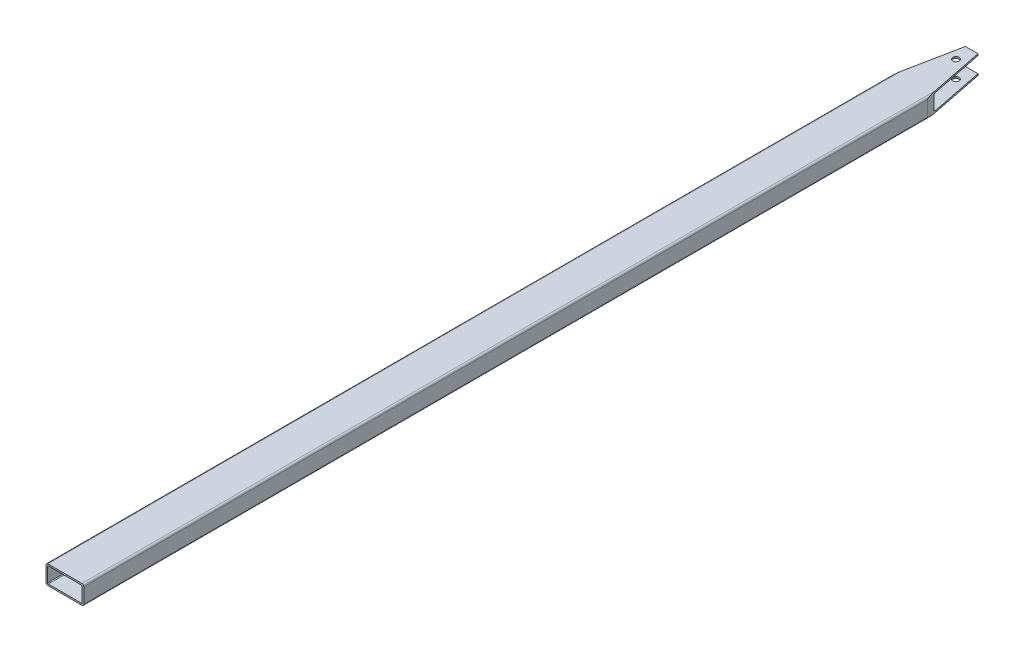
ISO-10303-21;
HEADER;
FILE_DESCRIPTION(('STEP AP214'),'2;1');
FILE_NAME('part.step','',(''),(''),'','','');
FILE_SCHEMA(('AUTOMOTIVE_DESIGN { 1 0 10303 214 1 1 1 1 }'));
ENDSEC;
DATA;
#1=APPLICATION_CONTEXT('core data for automotive mechanical design processes');
#2=APPLICATION_PROTOCOL_DEFINITION('international standard','automotive_design',2000,#1);
#3=PRODUCT_CONTEXT('',#1,'mechanical');
#4=PRODUCT('Part','Part','',(#3));
#5=PRODUCT_RELATED_PRODUCT_CATEGORY('part','',(#4));
#6=PRODUCT_DEFINITION_FORMATION('','',#4);
#7=PRODUCT_DEFINITION_CONTEXT('part definition',#1,'design');
#8=PRODUCT_DEFINITION('design','',#6,#7);
#9=PRODUCT_DEFINITION_SHAPE('','',#8);
#10=(LENGTH_UNIT() NAMED_UNIT(*) SI_UNIT(.MILLI.,.METRE.));
#11=(NAMED_UNIT(*) PLANE_ANGLE_UNIT() SI_UNIT($,.RADIAN.));
#12=(NAMED_UNIT(*) SI_UNIT($,.STERADIAN.) SOLID_ANGLE_UNIT());
#13=UNCERTAINTY_MEASURE_WITH_UNIT(LENGTH_MEASURE(1.E-05),#10,'distance_accuracy_value','');
#14=(GEOMETRIC_REPRESENTATION_CONTEXT(3) GLOBAL_UNCERTAINTY_ASSIGNED_CONTEXT((#13)) GLOBAL_UNIT_ASSIGNED_CONTEXT((#10,
#11,#12)) REPRESENTATION_CONTEXT('',''));
#15=CARTESIAN_POINT('',(0.,0.,0.));
#16=DIRECTION('',(0.,0.,1.));
#17=DIRECTION('',(1.,0.,0.));
#18=AXIS2_PLACEMENT_3D('',#15,#16,#17);
#19=CARTESIAN_POINT('',(34.29,-15.24,-914.4));
#20=DIRECTION('',(0.,0.,1.));
#21=DIRECTION('',(1.,0.,0.));
#22=AXIS2_PLACEMENT_3D('',#19,#20,#21);
#23=PLANE('',#22);
#24=DIRECTION('',(1.,0.,0.));
#25=VECTOR('',#24,1.);
#26=CARTESIAN_POINT('',(34.29,-19.05,-914.4));
#27=LINE('',#26,#25);
#28=CARTESIAN_POINT('',(-12.7000000000008,-19.05,-914.4));
#29=VERTEX_POINT('',#28);
#30=CARTESIAN_POINT('',(12.6999999999992,-19.05,-914.4));
#31=VERTEX_POINT('',#30);
#32=EDGE_CURVE('E190',#29,#31,#27,.T.);
#33=ORIENTED_EDGE('',*,*,#32,.F.);
#34=DIRECTION('',(0.,1.,0.));
#35=VECTOR('',#34,1.);
#36=CARTESIAN_POINT('',(-12.7000000000008,-19.05,-914.4));
#37=LINE('',#36,#35);
#38=CARTESIAN_POINT('',(-12.7000000000008,-15.875,-914.4));
#39=VERTEX_POINT('',#38);
#40=EDGE_CURVE('E172',#29,#39,#37,.T.);
#41=ORIENTED_EDGE('',*,*,#40,.T.);
#42=DIRECTION('',(1.,0.,0.));
#43=VECTOR('',#42,1.);
#44=CARTESIAN_POINT('',(33.3375,-15.875,-914.4));
#45=LINE('',#44,#43);
#46=CARTESIAN_POINT('',(12.6999999999992,-15.875,-914.4));
#47=VERTEX_POINT('',#46);
#48=EDGE_CURVE('E202',#39,#47,#45,.T.);
#49=ORIENTED_EDGE('',*,*,#48,.T.);
#50=DIRECTION('',(0.,1.,0.));
#51=VECTOR('',#50,1.);
#52=CARTESIAN_POINT('',(12.6999999999992,-19.05,-914.4));
#53=LINE('',#52,#51);
#54=EDGE_CURVE('E195',#31,#47,#53,.T.);
#55=ORIENTED_EDGE('',*,*,#54,.F.);
#56=EDGE_LOOP('',(#33,#41,#49,#55));
#57=FACE_BOUND('',#56,.T.);
#58=ADVANCED_FACE('F37',(#57),#23,.F.);
#59=CARTESIAN_POINT('',(34.29,-15.24,914.4));
#60=DIRECTION('',(0.,0.,1.));
#61=DIRECTION('',(1.,0.,0.));
#62=AXIS2_PLACEMENT_3D('',#59,#60,#61);
#63=PLANE('',#62);
#64=CARTESIAN_POINT('',(34.29,-15.24,914.4));
#65=DIRECTION('',(0.,0.,1.));
#66=DIRECTION('',(1.,0.,0.));
#67=AXIS2_PLACEMENT_3D('',#64,#65,#66);
#68=CIRCLE('',#67,3.81);
#69=CARTESIAN_POINT('',(34.29,-19.05,914.4));
#70=VERTEX_POINT('',#69);
#71=CARTESIAN_POINT('',(38.1,-15.24,914.4));
#72=VERTEX_POINT('',#71);
#73=EDGE_CURVE('E244',#70,#72,#68,.T.);
#74=ORIENTED_EDGE('',*,*,#73,.T.);
#75=DIRECTION('',(0.,1.,0.));
#76=VECTOR('',#75,1.);
#77=CARTESIAN_POINT('',(38.1,-15.24,914.4));
#78=LINE('',#77,#76);
#79=CARTESIAN_POINT('',(38.1,15.24,914.4));
#80=VERTEX_POINT('',#79);
#81=EDGE_CURVE('E247',#72,#80,#78,.T.);
#82=ORIENTED_EDGE('',*,*,#81,.T.);
#83=CARTESIAN_POINT('',(34.29,15.24,914.4));
#84=DIRECTION('',(0.,0.,1.));
#85=DIRECTION('',(1.,0.,0.));
#86=AXIS2_PLACEMENT_3D('',#83,#84,#85);
#87=CIRCLE('',#86,3.81);
#88=CARTESIAN_POINT('',(34.29,19.05,914.4));
#89=VERTEX_POINT('',#88);
#90=EDGE_CURVE('E249',#80,#89,#87,.T.);
#91=ORIENTED_EDGE('',*,*,#90,.T.);
#92=DIRECTION('',(-1.,0.,0.));
#93=VECTOR('',#92,1.);
#94=CARTESIAN_POINT('',(34.29,19.05,914.4));
#95=LINE('',#94,#93);
#96=CARTESIAN_POINT('',(-34.29,19.05,914.4));
#97=VERTEX_POINT('',#96);
#98=EDGE_CURVE('E251',#89,#97,#95,.T.);
#99=ORIENTED_EDGE('',*,*,#98,.T.);
#100=CARTESIAN_POINT('',(-34.29,15.24,914.4));
#101=DIRECTION('',(0.,0.,1.));
#102=DIRECTION('',(1.,0.,0.));
#103=AXIS2_PLACEMENT_3D('',#100,#101,#102);
#104=CIRCLE('',#103,3.81);
#105=CARTESIAN_POINT('',(-38.1,15.24,914.4));
#106=VERTEX_POINT('',#105);
#107=EDGE_CURVE('E253',#97,#106,#104,.T.);
#108=ORIENTED_EDGE('',*,*,#107,.T.);
#109=DIRECTION('',(0.,-1.,0.));
#110=VECTOR('',#109,1.);
#111=CARTESIAN_POINT('',(-38.1,-15.24,914.4));
#112=LINE('',#111,#110);
#113=CARTESIAN_POINT('',(-38.1,-15.24,914.4));
#114=VERTEX_POINT('',#113);
#115=EDGE_CURVE('E255',#106,#114,#112,.T.);
#116=ORIENTED_EDGE('',*,*,#115,.T.);
#117=CARTESIAN_POINT('',(-34.29,-15.24,914.4));
#118=DIRECTION('',(0.,0.,1.));
#119=DIRECTION('',(1.,0.,0.));
#120=AXIS2_PLACEMENT_3D('',#117,#118,#119);
#121=CIRCLE('',#120,3.81);
#122=CARTESIAN_POINT('',(-34.29,-19.05,914.4));
#123=VERTEX_POINT('',#122);
#124=EDGE_CURVE('E257',#114,#123,#121,.T.);
#125=ORIENTED_EDGE('',*,*,#124,.T.);
#126=DIRECTION('',(1.,0.,0.));
#127=VECTOR('',#126,1.);
#128=CARTESIAN_POINT('',(34.29,-19.05,914.4));
#129=LINE('',#128,#127);
#130=EDGE_CURVE('E259',#123,#70,#129,.T.);
#131=ORIENTED_EDGE('',*,*,#130,.T.);
#132=EDGE_LOOP('',(#74,#82,#91,#99,#108,#116,#125,#131));
#133=FACE_BOUND('',#132,.T.);
#134=DIRECTION('',(-1.,0.,0.));
#135=VECTOR('',#134,1.);
#136=CARTESIAN_POINT('',(33.3375,15.875,914.4));
#137=LINE('',#136,#135);
#138=CARTESIAN_POINT('',(33.3375,15.875,914.4));
#139=VERTEX_POINT('',#138);
#140=CARTESIAN_POINT('',(-33.3375,15.875,914.4));
#141=VERTEX_POINT('',#140);
#142=EDGE_CURVE('E199',#139,#141,#137,.T.);
#143=ORIENTED_EDGE('',*,*,#142,.F.);
#144=CARTESIAN_POINT('',(33.3375,14.2875,914.4));
#145=DIRECTION('',(0.,0.,1.));
#146=DIRECTION('',(1.,0.,0.));
#147=AXIS2_PLACEMENT_3D('',#144,#145,#146);
#148=CIRCLE('',#147,1.58749999999998);
#149=CARTESIAN_POINT('',(34.925,14.2875,914.4));
#150=VERTEX_POINT('',#149);
#151=EDGE_CURVE('E196',#150,#139,#148,.T.);
#152=ORIENTED_EDGE('',*,*,#151,.F.);
#153=DIRECTION('',(0.,1.,0.));
#154=VECTOR('',#153,1.);
#155=CARTESIAN_POINT('',(34.925,14.2875,914.4));
#156=LINE('',#155,#154);
#157=CARTESIAN_POINT('',(34.925,-14.2875,914.4));
#158=VERTEX_POINT('',#157);
#159=EDGE_CURVE('E218',#158,#150,#156,.T.);
#160=ORIENTED_EDGE('',*,*,#159,.F.);
#161=CARTESIAN_POINT('',(33.3375,-14.2875,914.4));
#162=DIRECTION('',(0.,0.,1.));
#163=DIRECTION('',(1.,0.,0.));
#164=AXIS2_PLACEMENT_3D('',#161,#162,#163);
#165=CIRCLE('',#164,1.58749999999999);
#166=CARTESIAN_POINT('',(33.3375,-15.875,914.4));
#167=VERTEX_POINT('',#166);
#168=EDGE_CURVE('E215',#167,#158,#165,.T.);
#169=ORIENTED_EDGE('',*,*,#168,.F.);
#170=DIRECTION('',(1.,0.,0.));
#171=VECTOR('',#170,1.);
#172=CARTESIAN_POINT('',(33.3375,-15.875,914.4));
#173=LINE('',#172,#171);
#174=CARTESIAN_POINT('',(-33.3375,-15.875,914.4));
#175=VERTEX_POINT('',#174);
#176=EDGE_CURVE('E213',#175,#167,#173,.T.);
#177=ORIENTED_EDGE('',*,*,#176,.F.);
#178=CARTESIAN_POINT('',(-33.3375,-14.2875,914.4));
#179=DIRECTION('',(0.,0.,1.));
#180=DIRECTION('',(1.,0.,0.));
#181=AXIS2_PLACEMENT_3D('',#178,#179,#180);
#182=CIRCLE('',#181,1.58749999999999);
#183=CARTESIAN_POINT('',(-34.925,-14.2875,914.4));
#184=VERTEX_POINT('',#183);
#185=EDGE_CURVE('E211',#184,#175,#182,.T.);
#186=ORIENTED_EDGE('',*,*,#185,.F.);
#187=DIRECTION('',(0.,-1.,0.));
#188=VECTOR('',#187,1.);
#189=CARTESIAN_POINT('',(-34.925,14.2875,914.4));
#190=LINE('',#189,#188);
#191=CARTESIAN_POINT('',(-34.925,14.2875,914.4));
#192=VERTEX_POINT('',#191);
#193=EDGE_CURVE('E209',#192,#184,#190,.T.);
#194=ORIENTED_EDGE('',*,*,#193,.F.);
#195=CARTESIAN_POINT('',(-33.3375,14.2875,914.4));
#196=DIRECTION('',(0.,0.,1.));
#197=DIRECTION('',(1.,0.,0.));
#198=AXIS2_PLACEMENT_3D('',#195,#196,#197);
#199=CIRCLE('',#198,1.58749999999999);
#200=EDGE_CURVE('E207',#141,#192,#199,.T.);
#201=ORIENTED_EDGE('',*,*,#200,.F.);
#202=EDGE_LOOP('',(#143,#152,#160,#169,#177,#186,#194,#201));
#203=FACE_BOUND('',#202,.T.);
#204=ADVANCED_FACE('F357',(#133,#203),#63,.T.);
#205=CARTESIAN_POINT('',(34.29,-15.24,914.4));
#206=DIRECTION('',(0.,0.,-1.));
#207=DIRECTION('',(-1.,0.,0.));
#208=AXIS2_PLACEMENT_3D('',#205,#206,#207);
#209=CYLINDRICAL_SURFACE('',#208,3.81);
#210=DIRECTION('',(0.,0.,-1.));
#211=VECTOR('',#210,1.);
#212=CARTESIAN_POINT('',(34.29,-19.05,914.4));
#213=LINE('',#212,#211);
#214=CARTESIAN_POINT('',(34.29,-19.05,-806.449999999999));
#215=VERTEX_POINT('',#214);
#216=EDGE_CURVE('E261',#70,#215,#213,.T.);
#217=ORIENTED_EDGE('',*,*,#216,.T.);
#218=CARTESIAN_POINT('',(34.29,-15.24,-806.45));
#219=DIRECTION('',(-0.980580675690919,0.,0.19611613513819));
#220=DIRECTION('',(-0.19611613513819,0.,-0.980580675690919));
#221=AXIS2_PLACEMENT_3D('',#218,#219,#220);
#222=ELLIPSE('',#221,19.4272643467879,3.81);
#223=CARTESIAN_POINT('',(38.1,-15.24,-787.4));
#224=VERTEX_POINT('',#223);
#225=EDGE_CURVE('E317',#215,#224,#222,.T.);
#226=ORIENTED_EDGE('',*,*,#225,.T.);
#227=DIRECTION('',(0.,0.,-1.));
#228=VECTOR('',#227,1.);
#229=CARTESIAN_POINT('',(38.1,-15.24,914.4));
#230=LINE('',#229,#228);
#231=EDGE_CURVE('E280',#72,#224,#230,.T.);
#232=ORIENTED_EDGE('',*,*,#231,.F.);
#233=ORIENTED_EDGE('',*,*,#73,.F.);
#234=EDGE_LOOP('',(#217,#226,#232,#233));
#235=FACE_BOUND('',#234,.T.);
#236=ADVANCED_FACE('F39',(#235),#209,.T.);
#237=CARTESIAN_POINT('',(38.1,-15.24,914.4));
#238=DIRECTION('',(-1.,0.,0.));
#239=DIRECTION('',(0.,0.,1.));
#240=AXIS2_PLACEMENT_3D('',#237,#238,#239);
#241=PLANE('',#240);
#242=ORIENTED_EDGE('',*,*,#231,.T.);
#243=DIRECTION('',(0.,1.,0.));
#244=VECTOR('',#243,1.);
#245=CARTESIAN_POINT('',(38.1,-19.05,-787.4));
#246=LINE('',#245,#244);
#247=CARTESIAN_POINT('',(38.1,15.24,-787.4));
#248=VERTEX_POINT('',#247);
#249=EDGE_CURVE('E339',#224,#248,#246,.T.);
#250=ORIENTED_EDGE('',*,*,#249,.T.);
#251=DIRECTION('',(0.,0.,-1.));
#252=VECTOR('',#251,1.);
#253=CARTESIAN_POINT('',(38.1,15.24,914.4));
#254=LINE('',#253,#252);
#255=EDGE_CURVE('E277',#80,#248,#254,.T.);
#256=ORIENTED_EDGE('',*,*,#255,.F.);
#257=ORIENTED_EDGE('',*,*,#81,.F.);
#258=EDGE_LOOP('',(#242,#250,#256,#257));
#259=FACE_BOUND('',#258,.T.);
#260=ADVANCED_FACE('F369',(#259),#241,.F.);
#261=CARTESIAN_POINT('',(34.29,15.24,914.4));
#262=DIRECTION('',(0.,0.,-1.));
#263=DIRECTION('',(-1.,0.,0.));
#264=AXIS2_PLACEMENT_3D('',#261,#262,#263);
#265=CYLINDRICAL_SURFACE('',#264,3.81);
#266=ORIENTED_EDGE('',*,*,#255,.T.);
#267=CARTESIAN_POINT('',(34.29,15.24,-806.45));
#268=DIRECTION('',(-0.980580675690919,0.,0.19611613513819));
#269=DIRECTION('',(-0.19611613513819,0.,-0.980580675690919));
#270=AXIS2_PLACEMENT_3D('',#267,#268,#269);
#271=ELLIPSE('',#270,19.4272643467879,3.81);
#272=CARTESIAN_POINT('',(34.29,19.05,-806.449999999999));
#273=VERTEX_POINT('',#272);
#274=EDGE_CURVE('E320',#248,#273,#271,.T.);
#275=ORIENTED_EDGE('',*,*,#274,.T.);
#276=DIRECTION('',(0.,0.,-1.));
#277=VECTOR('',#276,1.);
#278=CARTESIAN_POINT('',(34.29,19.05,914.4));
#279=LINE('',#278,#277);
#280=EDGE_CURVE('E274',#89,#273,#279,.T.);
#281=ORIENTED_EDGE('',*,*,#280,.F.);
#282=ORIENTED_EDGE('',*,*,#90,.F.);
#283=EDGE_LOOP('',(#266,#275,#281,#282));
#284=FACE_BOUND('',#283,.T.);
#285=ADVANCED_FACE('F366',(#284),#265,.T.);
#286=CARTESIAN_POINT('',(34.29,19.05,914.4));
#287=DIRECTION('',(0.,-1.,0.));
#288=DIRECTION('',(0.,0.,-1.));
#289=AXIS2_PLACEMENT_3D('',#286,#287,#288);
#290=PLANE('',#289);
#291=CARTESIAN_POINT('',(0.,19.05,-882.65));
#292=DIRECTION('',(0.,1.,0.));
#293=DIRECTION('',(0.,0.,1.));
#294=AXIS2_PLACEMENT_3D('',#291,#292,#293);
#295=CIRCLE('',#294,6.35);
#296=CARTESIAN_POINT('',(0.,19.05,-876.3));
#297=VERTEX_POINT('',#296);
#298=EDGE_CURVE('E331',#297,#297,#295,.T.);
#299=ORIENTED_EDGE('',*,*,#298,.F.);
#300=EDGE_LOOP('',(#299));
#301=FACE_BOUND('',#300,.T.);
#302=DIRECTION('',(-1.,0.,0.));
#303=VECTOR('',#302,1.);
#304=CARTESIAN_POINT('',(34.29,19.05,-914.4));
#305=LINE('',#304,#303);
#306=CARTESIAN_POINT('',(12.6999999999992,19.05,-914.4));
#307=VERTEX_POINT('',#306);
#308=CARTESIAN_POINT('',(-12.7000000000008,19.05,-914.4));
#309=VERTEX_POINT('',#308);
#310=EDGE_CURVE('E197',#307,#309,#305,.T.);
#311=ORIENTED_EDGE('',*,*,#310,.T.);
#312=DIRECTION('',(0.196116135138189,0.,-0.980580675690919));
#313=VECTOR('',#312,1.);
#314=CARTESIAN_POINT('',(-38.1000000000015,19.05,-787.4));
#315=LINE('',#314,#313);
#316=CARTESIAN_POINT('',(-34.2900000000002,19.05,-806.450000000004));
#317=VERTEX_POINT('',#316);
#318=EDGE_CURVE('E53',#317,#309,#315,.T.);
#319=ORIENTED_EDGE('',*,*,#318,.F.);
#320=DIRECTION('',(0.,0.,-1.));
#321=VECTOR('',#320,1.);
#322=CARTESIAN_POINT('',(-34.29,19.05,914.4));
#323=LINE('',#322,#321);
#324=EDGE_CURVE('E271',#97,#317,#323,.T.);
#325=ORIENTED_EDGE('',*,*,#324,.F.);
#326=ORIENTED_EDGE('',*,*,#98,.F.);
#327=ORIENTED_EDGE('',*,*,#280,.T.);
#328=DIRECTION('',(0.19611613513819,0.,0.980580675690919));
#329=VECTOR('',#328,1.);
#330=CARTESIAN_POINT('',(12.6999999999992,19.05,-914.4));
#331=LINE('',#330,#329);
#332=EDGE_CURVE('E337',#307,#273,#331,.T.);
#333=ORIENTED_EDGE('',*,*,#332,.F.);
#334=EDGE_LOOP('',(#311,#319,#325,#326,#327,#333));
#335=FACE_BOUND('',#334,.T.);
#336=ADVANCED_FACE('F363',(#301,#335),#290,.F.);
#337=CARTESIAN_POINT('',(-34.29,15.24,914.4));
#338=DIRECTION('',(0.,0.,-1.));
#339=DIRECTION('',(-1.,0.,0.));
#340=AXIS2_PLACEMENT_3D('',#337,#338,#339);
#341=CYLINDRICAL_SURFACE('',#340,3.81);
#342=ORIENTED_EDGE('',*,*,#324,.T.);
#343=CARTESIAN_POINT('',(-34.29,15.24,-806.450000000007));
#344=DIRECTION('',(0.980580675690919,0.,0.196116135138189));
#345=DIRECTION('',(0.196116135138189,0.,-0.980580675690919));
#346=AXIS2_PLACEMENT_3D('',#343,#344,#345);
#347=ELLIPSE('',#346,19.427264346788,3.81);
#348=CARTESIAN_POINT('',(-38.1000000000015,15.24,-787.4));
#349=VERTEX_POINT('',#348);
#350=EDGE_CURVE('E304',#317,#349,#347,.T.);
#351=ORIENTED_EDGE('',*,*,#350,.T.);
#352=DIRECTION('',(0.,0.,-1.));
#353=VECTOR('',#352,1.);
#354=CARTESIAN_POINT('',(-38.1,15.24,914.4));
#355=LINE('',#354,#353);
#356=EDGE_CURVE('E268',#106,#349,#355,.T.);
#357=ORIENTED_EDGE('',*,*,#356,.F.);
#358=ORIENTED_EDGE('',*,*,#107,.F.);
#359=EDGE_LOOP('',(#342,#351,#357,#358));
#360=FACE_BOUND('',#359,.T.);
#361=ADVANCED_FACE('F350',(#360),#341,.T.);
#362=CARTESIAN_POINT('',(-38.1,-15.24,914.4));
#363=DIRECTION('',(1.,0.,0.));
#364=DIRECTION('',(0.,0.,-1.));
#365=AXIS2_PLACEMENT_3D('',#362,#363,#364);
#366=PLANE('',#365);
#367=ORIENTED_EDGE('',*,*,#356,.T.);
#368=DIRECTION('',(0.,1.,0.));
#369=VECTOR('',#368,1.);
#370=CARTESIAN_POINT('',(-38.1000000000015,-19.05,-787.4));
#371=LINE('',#370,#369);
#372=CARTESIAN_POINT('',(-38.1,-15.24,-787.400000000007));
#373=VERTEX_POINT('',#372);
#374=EDGE_CURVE('E184',#373,#349,#371,.T.);
#375=ORIENTED_EDGE('',*,*,#374,.F.);
#376=DIRECTION('',(0.,0.,-1.));
#377=VECTOR('',#376,1.);
#378=CARTESIAN_POINT('',(-38.1,-15.24,914.4));
#379=LINE('',#378,#377);
#380=EDGE_CURVE('E265',#114,#373,#379,.T.);
#381=ORIENTED_EDGE('',*,*,#380,.F.);
#382=ORIENTED_EDGE('',*,*,#115,.F.);
#383=EDGE_LOOP('',(#367,#375,#381,#382));
#384=FACE_BOUND('',#383,.T.);
#385=ADVANCED_FACE('F354',(#384),#366,.F.);
#386=CARTESIAN_POINT('',(-34.29,-15.24,914.4));
#387=DIRECTION('',(0.,0.,-1.));
#388=DIRECTION('',(-1.,0.,0.));
#389=AXIS2_PLACEMENT_3D('',#386,#387,#388);
#390=CYLINDRICAL_SURFACE('',#389,3.81);
#391=ORIENTED_EDGE('',*,*,#380,.T.);
#392=CARTESIAN_POINT('',(-34.29,-15.24,-806.450000000007));
#393=DIRECTION('',(0.980580675690919,0.,0.196116135138189));
#394=DIRECTION('',(0.196116135138189,0.,-0.980580675690919));
#395=AXIS2_PLACEMENT_3D('',#392,#393,#394);
#396=ELLIPSE('',#395,19.427264346788,3.81);
#397=CARTESIAN_POINT('',(-34.2899999999999,-19.05,-806.450000000007));
#398=VERTEX_POINT('',#397);
#399=EDGE_CURVE('E307',#373,#398,#396,.T.);
#400=ORIENTED_EDGE('',*,*,#399,.T.);
#401=DIRECTION('',(0.,0.,-1.));
#402=VECTOR('',#401,1.);
#403=CARTESIAN_POINT('',(-34.29,-19.05,914.4));
#404=LINE('',#403,#402);
#405=EDGE_CURVE('E193',#123,#398,#404,.T.);
#406=ORIENTED_EDGE('',*,*,#405,.F.);
#407=ORIENTED_EDGE('',*,*,#124,.F.);
#408=EDGE_LOOP('',(#391,#400,#406,#407));
#409=FACE_BOUND('',#408,.T.);
#410=ADVANCED_FACE('F428',(#409),#390,.T.);
#411=CARTESIAN_POINT('',(34.29,-19.05,914.4));
#412=DIRECTION('',(0.,1.,0.));
#413=DIRECTION('',(0.,0.,1.));
#414=AXIS2_PLACEMENT_3D('',#411,#412,#413);
#415=PLANE('',#414);
#416=CARTESIAN_POINT('',(0.,-19.05,-882.65));
#417=DIRECTION('',(0.,1.,0.));
#418=DIRECTION('',(0.,0.,1.));
#419=AXIS2_PLACEMENT_3D('',#416,#417,#418);
#420=CIRCLE('',#419,6.35);
#421=CARTESIAN_POINT('',(0.,-19.05,-876.3));
#422=VERTEX_POINT('',#421);
#423=EDGE_CURVE('E334',#422,#422,#420,.T.);
#424=ORIENTED_EDGE('',*,*,#423,.T.);
#425=EDGE_LOOP('',(#424));
#426=FACE_BOUND('',#425,.T.);
#427=ORIENTED_EDGE('',*,*,#405,.T.);
#428=DIRECTION('',(0.196116135138189,0.,-0.980580675690919));
#429=VECTOR('',#428,1.);
#430=CARTESIAN_POINT('',(-38.1000000000015,-19.05,-787.4));
#431=LINE('',#430,#429);
#432=EDGE_CURVE('E175',#398,#29,#431,.T.);
#433=ORIENTED_EDGE('',*,*,#432,.T.);
#434=ORIENTED_EDGE('',*,*,#32,.T.);
#435=DIRECTION('',(0.19611613513819,0.,0.980580675690919));
#436=VECTOR('',#435,1.);
#437=CARTESIAN_POINT('',(12.6999999999992,-19.05,-914.4));
#438=LINE('',#437,#436);
#439=EDGE_CURVE('E60',#31,#215,#438,.T.);
#440=ORIENTED_EDGE('',*,*,#439,.T.);
#441=ORIENTED_EDGE('',*,*,#216,.F.);
#442=ORIENTED_EDGE('',*,*,#130,.F.);
#443=EDGE_LOOP('',(#427,#433,#434,#440,#441,#442));
#444=FACE_BOUND('',#443,.T.);
#445=ADVANCED_FACE('F189',(#426,#444),#415,.F.);
#446=CARTESIAN_POINT('',(33.3375,14.2875,914.4));
#447=DIRECTION('',(0.,0.,-1.));
#448=DIRECTION('',(-1.,0.,0.));
#449=AXIS2_PLACEMENT_3D('',#446,#447,#448);
#450=CYLINDRICAL_SURFACE('',#449,1.58749999999998);
#451=CARTESIAN_POINT('',(33.3375,14.2875,-811.212499999999));
#452=DIRECTION('',(-0.980580675690919,0.,0.19611613513819));
#453=DIRECTION('',(-0.19611613513819,0.,-0.980580675690919));
#454=AXIS2_PLACEMENT_3D('',#451,#452,#453);
#455=ELLIPSE('',#454,8.09469347782823,1.58749999999998);
#456=CARTESIAN_POINT('',(34.925,14.2875,-803.275));
#457=VERTEX_POINT('',#456);
#458=CARTESIAN_POINT('',(33.3375,15.875,-811.212499999999));
#459=VERTEX_POINT('',#458);
#460=EDGE_CURVE('E324',#457,#459,#455,.T.);
#461=ORIENTED_EDGE('',*,*,#460,.F.);
#462=DIRECTION('',(0.,0.,-1.));
#463=VECTOR('',#462,1.);
#464=CARTESIAN_POINT('',(34.925,14.2875,914.4));
#465=LINE('',#464,#463);
#466=EDGE_CURVE('E220',#150,#457,#465,.T.);
#467=ORIENTED_EDGE('',*,*,#466,.F.);
#468=ORIENTED_EDGE('',*,*,#151,.T.);
#469=DIRECTION('',(0.,0.,-1.));
#470=VECTOR('',#469,1.);
#471=CARTESIAN_POINT('',(33.3375,15.875,914.4));
#472=LINE('',#471,#470);
#473=EDGE_CURVE('E241',#139,#459,#472,.T.);
#474=ORIENTED_EDGE('',*,*,#473,.T.);
#475=EDGE_LOOP('',(#461,#467,#468,#474));
#476=FACE_BOUND('',#475,.T.);
#477=ADVANCED_FACE('F422',(#476),#450,.F.);
#478=CARTESIAN_POINT('',(33.3375,15.875,914.4));
#479=DIRECTION('',(0.,-1.,0.));
#480=DIRECTION('',(1.,0.,0.));
#481=AXIS2_PLACEMENT_3D('',#478,#479,#480);
#482=PLANE('',#481);
#483=DIRECTION('',(-0.196116135138189,0.,0.980580675690919));
#484=VECTOR('',#483,1.);
#485=CARTESIAN_POINT('',(-362.621634615394,15.8750000000001,835.208173076919));
#486=LINE('',#485,#484);
#487=CARTESIAN_POINT('',(-12.7000000000008,15.875,-914.4));
#488=VERTEX_POINT('',#487);
#489=CARTESIAN_POINT('',(-33.3375,15.875,-811.212500000007));
#490=VERTEX_POINT('',#489);
#491=EDGE_CURVE('E298',#488,#490,#486,.T.);
#492=ORIENTED_EDGE('',*,*,#491,.F.);
#493=DIRECTION('',(-1.,0.,0.));
#494=VECTOR('',#493,1.);
#495=CARTESIAN_POINT('',(33.3375,15.875,-914.4));
#496=LINE('',#495,#494);
#497=CARTESIAN_POINT('',(12.6999999999992,15.875,-914.4));
#498=VERTEX_POINT('',#497);
#499=EDGE_CURVE('E289',#498,#488,#496,.T.);
#500=ORIENTED_EDGE('',*,*,#499,.F.);
#501=DIRECTION('',(-0.19611613513819,0.,-0.980580675690919));
#502=VECTOR('',#501,1.);
#503=CARTESIAN_POINT('',(365.186057692317,15.8749999999999,848.030288461534));
#504=LINE('',#503,#502);
#505=EDGE_CURVE('E297',#459,#498,#504,.T.);
#506=ORIENTED_EDGE('',*,*,#505,.F.);
#507=ORIENTED_EDGE('',*,*,#473,.F.);
#508=ORIENTED_EDGE('',*,*,#142,.T.);
#509=DIRECTION('',(0.,0.,-1.));
#510=VECTOR('',#509,1.);
#511=CARTESIAN_POINT('',(-33.3375,15.875,914.4));
#512=LINE('',#511,#510);
#513=EDGE_CURVE('E238',#141,#490,#512,.T.);
#514=ORIENTED_EDGE('',*,*,#513,.T.);
#515=EDGE_LOOP('',(#492,#500,#506,#507,#508,#514));
#516=FACE_BOUND('',#515,.T.);
#517=CARTESIAN_POINT('',(0.,15.875,-882.65));
#518=DIRECTION('',(0.,-1.,0.));
#519=DIRECTION('',(1.,0.,0.));
#520=AXIS2_PLACEMENT_3D('',#517,#518,#519);
#521=CIRCLE('',#520,6.35);
#522=CARTESIAN_POINT('',(6.35,15.875,-882.65));
#523=VERTEX_POINT('',#522);
#524=EDGE_CURVE('E299',#523,#523,#521,.T.);
#525=ORIENTED_EDGE('',*,*,#524,.F.);
#526=EDGE_LOOP('',(#525));
#527=FACE_BOUND('',#526,.T.);
#528=ADVANCED_FACE('F294',(#516,#527),#482,.T.);
#529=CARTESIAN_POINT('',(-33.3375,14.2875,914.4));
#530=DIRECTION('',(0.,0.,-1.));
#531=DIRECTION('',(-1.,0.,0.));
#532=AXIS2_PLACEMENT_3D('',#529,#530,#531);
#533=CYLINDRICAL_SURFACE('',#532,1.58749999999999);
#534=CARTESIAN_POINT('',(-33.3375,14.2875,-811.212500000007));
#535=DIRECTION('',(0.980580675690919,0.,0.196116135138189));
#536=DIRECTION('',(0.196116135138189,0.,-0.980580675690919));
#537=AXIS2_PLACEMENT_3D('',#534,#535,#536);
#538=ELLIPSE('',#537,8.09469347782829,1.58749999999999);
#539=CARTESIAN_POINT('',(-34.925,14.2875,-803.275000000007));
#540=VERTEX_POINT('',#539);
#541=EDGE_CURVE('E310',#490,#540,#538,.T.);
#542=ORIENTED_EDGE('',*,*,#541,.F.);
#543=ORIENTED_EDGE('',*,*,#513,.F.);
#544=ORIENTED_EDGE('',*,*,#200,.T.);
#545=DIRECTION('',(0.,0.,-1.));
#546=VECTOR('',#545,1.);
#547=CARTESIAN_POINT('',(-34.925,14.2875,914.4));
#548=LINE('',#547,#546);
#549=EDGE_CURVE('E235',#192,#540,#548,.T.);
#550=ORIENTED_EDGE('',*,*,#549,.T.);
#551=EDGE_LOOP('',(#542,#543,#544,#550));
#552=FACE_BOUND('',#551,.T.);
#553=ADVANCED_FACE('F415',(#552),#533,.F.);
#554=CARTESIAN_POINT('',(-34.925,14.2875,914.4));
#555=DIRECTION('',(1.,0.,0.));
#556=DIRECTION('',(0.,0.,-1.));
#557=AXIS2_PLACEMENT_3D('',#554,#555,#556);
#558=PLANE('',#557);
#559=DIRECTION('',(0.,-1.,0.));
#560=VECTOR('',#559,1.);
#561=CARTESIAN_POINT('',(-34.925,14.2875,-803.275000000007));
#562=LINE('',#561,#560);
#563=CARTESIAN_POINT('',(-34.925,-14.2875,-803.275000000007));
#564=VERTEX_POINT('',#563);
#565=EDGE_CURVE('E312',#540,#564,#562,.T.);
#566=ORIENTED_EDGE('',*,*,#565,.F.);
#567=ORIENTED_EDGE('',*,*,#549,.F.);
#568=ORIENTED_EDGE('',*,*,#193,.T.);
#569=DIRECTION('',(0.,0.,-1.));
#570=VECTOR('',#569,1.);
#571=CARTESIAN_POINT('',(-34.925,-14.2875,914.4));
#572=LINE('',#571,#570);
#573=EDGE_CURVE('E232',#184,#564,#572,.T.);
#574=ORIENTED_EDGE('',*,*,#573,.T.);
#575=EDGE_LOOP('',(#566,#567,#568,#574));
#576=FACE_BOUND('',#575,.T.);
#577=ADVANCED_FACE('F411',(#576),#558,.T.);
#578=CARTESIAN_POINT('',(-33.3375,-14.2875,914.4));
#579=DIRECTION('',(0.,0.,-1.));
#580=DIRECTION('',(-1.,0.,0.));
#581=AXIS2_PLACEMENT_3D('',#578,#579,#580);
#582=CYLINDRICAL_SURFACE('',#581,1.58749999999999);
#583=CARTESIAN_POINT('',(-33.3375,-14.2875,-811.212500000007));
#584=DIRECTION('',(0.980580675690919,0.,0.196116135138189));
#585=DIRECTION('',(0.196116135138189,0.,-0.980580675690919));
#586=AXIS2_PLACEMENT_3D('',#583,#584,#585);
#587=ELLIPSE('',#586,8.09469347782829,1.58749999999999);
#588=CARTESIAN_POINT('',(-33.3375,-15.875,-811.212500000007));
#589=VERTEX_POINT('',#588);
#590=EDGE_CURVE('E314',#564,#589,#587,.T.);
#591=ORIENTED_EDGE('',*,*,#590,.F.);
#592=ORIENTED_EDGE('',*,*,#573,.F.);
#593=ORIENTED_EDGE('',*,*,#185,.T.);
#594=DIRECTION('',(0.,0.,-1.));
#595=VECTOR('',#594,1.);
#596=CARTESIAN_POINT('',(-33.3375,-15.875,914.4));
#597=LINE('',#596,#595);
#598=EDGE_CURVE('E229',#175,#589,#597,.T.);
#599=ORIENTED_EDGE('',*,*,#598,.T.);
#600=EDGE_LOOP('',(#591,#592,#593,#599));
#601=FACE_BOUND('',#600,.T.);
#602=ADVANCED_FACE('F407',(#601),#582,.F.);
#603=CARTESIAN_POINT('',(33.3375,-15.875,914.4));
#604=DIRECTION('',(0.,1.,0.));
#605=DIRECTION('',(-1.,0.,0.));
#606=AXIS2_PLACEMENT_3D('',#603,#604,#605);
#607=PLANE('',#606);
#608=DIRECTION('',(0.196116135138189,0.,-0.980580675690919));
#609=VECTOR('',#608,1.);
#610=CARTESIAN_POINT('',(-362.621634615394,-15.875,835.208173076919));
#611=LINE('',#610,#609);
#612=EDGE_CURVE('E178',#589,#39,#611,.T.);
#613=ORIENTED_EDGE('',*,*,#612,.F.);
#614=ORIENTED_EDGE('',*,*,#598,.F.);
#615=ORIENTED_EDGE('',*,*,#176,.T.);
#616=DIRECTION('',(0.,0.,-1.));
#617=VECTOR('',#616,1.);
#618=CARTESIAN_POINT('',(33.3375,-15.875,914.4));
#619=LINE('',#618,#617);
#620=CARTESIAN_POINT('',(33.3375,-15.875,-811.212499999999));
#621=VERTEX_POINT('',#620);
#622=EDGE_CURVE('E226',#167,#621,#619,.T.);
#623=ORIENTED_EDGE('',*,*,#622,.T.);
#624=DIRECTION('',(0.19611613513819,0.,0.980580675690919));
#625=VECTOR('',#624,1.);
#626=CARTESIAN_POINT('',(365.186057692317,-15.875,848.030288461534));
#627=LINE('',#626,#625);
#628=EDGE_CURVE('E326',#47,#621,#627,.T.);
#629=ORIENTED_EDGE('',*,*,#628,.F.);
#630=ORIENTED_EDGE('',*,*,#48,.F.);
#631=EDGE_LOOP('',(#613,#614,#615,#623,#629,#630));
#632=FACE_BOUND('',#631,.T.);
#633=CARTESIAN_POINT('',(0.,-15.875,-882.65));
#634=DIRECTION('',(0.,1.,0.));
#635=DIRECTION('',(-1.,0.,0.));
#636=AXIS2_PLACEMENT_3D('',#633,#634,#635);
#637=CIRCLE('',#636,6.35);
#638=CARTESIAN_POINT('',(-6.34999999999999,-15.875,-882.65));
#639=VERTEX_POINT('',#638);
#640=EDGE_CURVE('E41',#639,#639,#637,.T.);
#641=ORIENTED_EDGE('',*,*,#640,.F.);
#642=EDGE_LOOP('',(#641));
#643=FACE_BOUND('',#642,.T.);
#644=ADVANCED_FACE('F400',(#632,#643),#607,.T.);
#645=CARTESIAN_POINT('',(33.3375,-14.2875,914.4));
#646=DIRECTION('',(0.,0.,-1.));
#647=DIRECTION('',(-1.,0.,0.));
#648=AXIS2_PLACEMENT_3D('',#645,#646,#647);
#649=CYLINDRICAL_SURFACE('',#648,1.58749999999999);
#650=CARTESIAN_POINT('',(33.3375,-14.2875,-811.212499999999));
#651=DIRECTION('',(-0.980580675690919,0.,0.19611613513819));
#652=DIRECTION('',(-0.19611613513819,0.,-0.980580675690919));
#653=AXIS2_PLACEMENT_3D('',#650,#651,#652);
#654=ELLIPSE('',#653,8.09469347782826,1.58749999999999);
#655=CARTESIAN_POINT('',(34.925,-14.2875,-803.275));
#656=VERTEX_POINT('',#655);
#657=EDGE_CURVE('E328',#621,#656,#654,.T.);
#658=ORIENTED_EDGE('',*,*,#657,.F.);
#659=ORIENTED_EDGE('',*,*,#622,.F.);
#660=ORIENTED_EDGE('',*,*,#168,.T.);
#661=DIRECTION('',(0.,0.,-1.));
#662=VECTOR('',#661,1.);
#663=CARTESIAN_POINT('',(34.925,-14.2875,914.4));
#664=LINE('',#663,#662);
#665=EDGE_CURVE('E223',#158,#656,#664,.T.);
#666=ORIENTED_EDGE('',*,*,#665,.T.);
#667=EDGE_LOOP('',(#658,#659,#660,#666));
#668=FACE_BOUND('',#667,.T.);
#669=ADVANCED_FACE('F395',(#668),#649,.F.);
#670=CARTESIAN_POINT('',(34.925,14.2875,914.4));
#671=DIRECTION('',(-1.,0.,0.));
#672=DIRECTION('',(0.,-1.,0.));
#673=AXIS2_PLACEMENT_3D('',#670,#671,#672);
#674=PLANE('',#673);
#675=DIRECTION('',(0.,1.,0.));
#676=VECTOR('',#675,1.);
#677=CARTESIAN_POINT('',(34.925,14.2874999999979,-803.275));
#678=LINE('',#677,#676);
#679=EDGE_CURVE('E183',#656,#457,#678,.T.);
#680=ORIENTED_EDGE('',*,*,#679,.F.);
#681=ORIENTED_EDGE('',*,*,#665,.F.);
#682=ORIENTED_EDGE('',*,*,#159,.T.);
#683=ORIENTED_EDGE('',*,*,#466,.T.);
#684=EDGE_LOOP('',(#680,#681,#682,#683));
#685=FACE_BOUND('',#684,.T.);
#686=ADVANCED_FACE('F388',(#685),#674,.T.);
#687=ORIENTED_EDGE('',*,*,#499,.T.);
#688=DIRECTION('',(0.,1.,0.));
#689=VECTOR('',#688,1.);
#690=CARTESIAN_POINT('',(-12.7000000000008,-15.24,-914.4));
#691=LINE('',#690,#689);
#692=EDGE_CURVE('E11',#488,#309,#691,.T.);
#693=ORIENTED_EDGE('',*,*,#692,.T.);
#694=ORIENTED_EDGE('',*,*,#310,.F.);
#695=DIRECTION('',(0.,-1.,0.));
#696=VECTOR('',#695,1.);
#697=CARTESIAN_POINT('',(12.6999999999992,-15.24,-914.4));
#698=LINE('',#697,#696);
#699=EDGE_CURVE('E46',#307,#498,#698,.T.);
#700=ORIENTED_EDGE('',*,*,#699,.T.);
#701=EDGE_LOOP('',(#687,#693,#694,#700));
#702=FACE_BOUND('',#701,.T.);
#703=ADVANCED_FACE('F288',(#702),#23,.F.);
#704=CARTESIAN_POINT('',(12.6999999999992,-19.05,-914.4));
#705=DIRECTION('',(-0.980580675690919,0.,0.19611613513819));
#706=DIRECTION('',(0.19611613513819,0.,0.980580675690919));
#707=AXIS2_PLACEMENT_3D('',#704,#705,#706);
#708=PLANE('',#707);
#709=ORIENTED_EDGE('',*,*,#439,.F.);
#710=ORIENTED_EDGE('',*,*,#54,.T.);
#711=ORIENTED_EDGE('',*,*,#628,.T.);
#712=ORIENTED_EDGE('',*,*,#657,.T.);
#713=ORIENTED_EDGE('',*,*,#679,.T.);
#714=ORIENTED_EDGE('',*,*,#460,.T.);
#715=ORIENTED_EDGE('',*,*,#505,.T.);
#716=ORIENTED_EDGE('',*,*,#699,.F.);
#717=ORIENTED_EDGE('',*,*,#332,.T.);
#718=ORIENTED_EDGE('',*,*,#274,.F.);
#719=ORIENTED_EDGE('',*,*,#249,.F.);
#720=ORIENTED_EDGE('',*,*,#225,.F.);
#721=EDGE_LOOP('',(#709,#710,#711,#712,#713,#714,#715,#716,#717,#718,#719,#720));
#722=FACE_BOUND('',#721,.T.);
#723=ADVANCED_FACE('F364',(#722),#708,.F.);
#724=CARTESIAN_POINT('',(-38.1000000000015,-19.05,-787.4));
#725=DIRECTION('',(0.980580675690919,0.,0.196116135138189));
#726=DIRECTION('',(0.196116135138189,0.,-0.980580675690919));
#727=AXIS2_PLACEMENT_3D('',#724,#725,#726);
#728=PLANE('',#727);
#729=ORIENTED_EDGE('',*,*,#318,.T.);
#730=ORIENTED_EDGE('',*,*,#692,.F.);
#731=ORIENTED_EDGE('',*,*,#491,.T.);
#732=ORIENTED_EDGE('',*,*,#541,.T.);
#733=ORIENTED_EDGE('',*,*,#565,.T.);
#734=ORIENTED_EDGE('',*,*,#590,.T.);
#735=ORIENTED_EDGE('',*,*,#612,.T.);
#736=ORIENTED_EDGE('',*,*,#40,.F.);
#737=ORIENTED_EDGE('',*,*,#432,.F.);
#738=ORIENTED_EDGE('',*,*,#399,.F.);
#739=ORIENTED_EDGE('',*,*,#374,.T.);
#740=ORIENTED_EDGE('',*,*,#350,.F.);
#741=EDGE_LOOP('',(#729,#730,#731,#732,#733,#734,#735,#736,#737,#738,#739,#740));
#742=FACE_BOUND('',#741,.T.);
#743=ADVANCED_FACE('F174',(#742),#728,.F.);
#744=CARTESIAN_POINT('',(0.,-19.05,-882.65));
#745=DIRECTION('',(0.,1.,0.));
#746=DIRECTION('',(0.,0.,1.));
#747=AXIS2_PLACEMENT_3D('',#744,#745,#746);
#748=CYLINDRICAL_SURFACE('',#747,6.35);
#749=ORIENTED_EDGE('',*,*,#640,.T.);
#750=EDGE_LOOP('',(#749));
#751=FACE_BOUND('',#750,.T.);
#752=ORIENTED_EDGE('',*,*,#423,.F.);
#753=EDGE_LOOP('',(#752));
#754=FACE_BOUND('',#753,.T.);
#755=ADVANCED_FACE('F516',(#751,#754),#748,.F.);
#756=ORIENTED_EDGE('',*,*,#524,.T.);
#757=EDGE_LOOP('',(#756));
#758=FACE_BOUND('',#757,.T.);
#759=ORIENTED_EDGE('',*,*,#298,.T.);
#760=EDGE_LOOP('',(#759));
#761=FACE_BOUND('',#760,.T.);
#762=ADVANCED_FACE('F523',(#758,#761),#748,.F.);
#763=CLOSED_SHELL('',(#58,#204,#236,#260,#285,#336,#361,#385,#410,#445,#477,#528,#553,#577,#602,
#644,#669,#686,#703,#723,#743,#755,#762));
#764=MANIFOLD_SOLID_BREP('B2',#763);
#765=ADVANCED_BREP_SHAPE_REPRESENTATION('',(#18,#764),#14);
#766=SHAPE_DEFINITION_REPRESENTATION(#9,#765);
ENDSEC;
END-ISO-10303-21;
